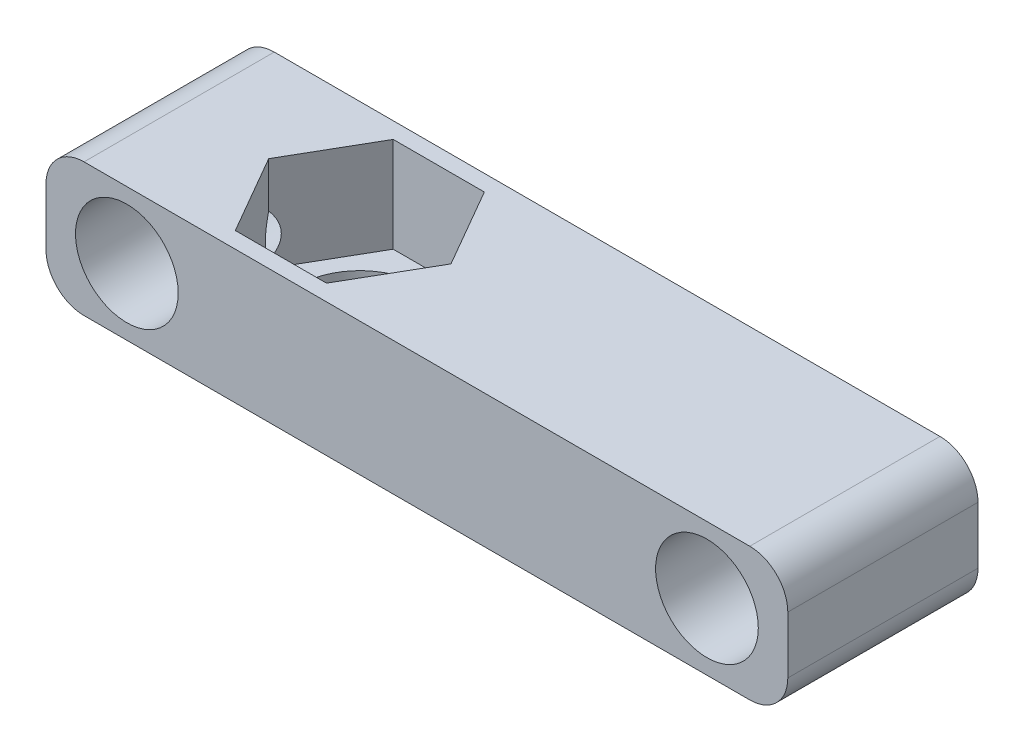
ISO-10303-21;
HEADER;
FILE_DESCRIPTION(('STEP AP214'),'2;1');
FILE_NAME('part.step','',(''),(''),'','','');
FILE_SCHEMA(('AUTOMOTIVE_DESIGN { 1 0 10303 214 1 1 1 1 }'));
ENDSEC;
DATA;
#1=APPLICATION_CONTEXT('core data for automotive mechanical design processes');
#2=APPLICATION_PROTOCOL_DEFINITION('international standard','automotive_design',2000,#1);
#3=PRODUCT_CONTEXT('',#1,'mechanical');
#4=PRODUCT('Part','Part','',(#3));
#5=PRODUCT_RELATED_PRODUCT_CATEGORY('part','',(#4));
#6=PRODUCT_DEFINITION_FORMATION('','',#4);
#7=PRODUCT_DEFINITION_CONTEXT('part definition',#1,'design');
#8=PRODUCT_DEFINITION('design','',#6,#7);
#9=PRODUCT_DEFINITION_SHAPE('','',#8);
#10=(LENGTH_UNIT() NAMED_UNIT(*) SI_UNIT(.MILLI.,.METRE.));
#11=(NAMED_UNIT(*) PLANE_ANGLE_UNIT() SI_UNIT($,.RADIAN.));
#12=(NAMED_UNIT(*) SI_UNIT($,.STERADIAN.) SOLID_ANGLE_UNIT());
#13=UNCERTAINTY_MEASURE_WITH_UNIT(LENGTH_MEASURE(1.E-05),#10,'distance_accuracy_value','');
#14=(GEOMETRIC_REPRESENTATION_CONTEXT(3) GLOBAL_UNCERTAINTY_ASSIGNED_CONTEXT((#13)) GLOBAL_UNIT_ASSIGNED_CONTEXT((#10,
#11,#12)) REPRESENTATION_CONTEXT('',''));
#15=CARTESIAN_POINT('',(0.,0.,0.));
#16=DIRECTION('',(0.,0.,1.));
#17=DIRECTION('',(1.,0.,0.));
#18=AXIS2_PLACEMENT_3D('',#15,#16,#17);
#19=CARTESIAN_POINT('',(-32.1206908736811,15.8780487804878,0.849999999999996));
#20=DIRECTION('',(0.866025403784439,0.,-0.5));
#21=DIRECTION('',(-0.5,0.,-0.866025403784439));
#22=AXIS2_PLACEMENT_3D('',#19,#20,#21);
#23=PLANE('',#22);
#24=DIRECTION('',(0.5,0.,0.866025403784439));
#25=VECTOR('',#24,1.);
#26=CARTESIAN_POINT('',(-32.120690873681,10.8780487804878,0.85));
#27=LINE('',#26,#25);
#28=CARTESIAN_POINT('',(-32.1206908736811,10.8780487804878,0.849999999999996));
#29=VERTEX_POINT('',#28);
#30=CARTESIAN_POINT('',(-29.7246872565441,10.8780487804878,5.));
#31=VERTEX_POINT('',#30);
#32=EDGE_CURVE('E155',#29,#31,#27,.T.);
#33=ORIENTED_EDGE('',*,*,#32,.T.);
#34=DIRECTION('',(0.,-1.,0.));
#35=VECTOR('',#34,1.);
#36=CARTESIAN_POINT('',(-29.7246872565441,15.8780487804878,5.00000000000001));
#37=LINE('',#36,#35);
#38=CARTESIAN_POINT('',(-29.7246872565441,15.8780487804878,5.00000000000001));
#39=VERTEX_POINT('',#38);
#40=EDGE_CURVE('E139',#39,#31,#37,.T.);
#41=ORIENTED_EDGE('',*,*,#40,.F.);
#42=DIRECTION('',(0.5,0.,0.866025403784439));
#43=VECTOR('',#42,1.);
#44=CARTESIAN_POINT('',(-32.1206908736811,15.8780487804878,0.849999999999996));
#45=LINE('',#44,#43);
#46=CARTESIAN_POINT('',(-32.1206908736811,15.8780487804878,0.849999999999996));
#47=VERTEX_POINT('',#46);
#48=EDGE_CURVE('E172',#47,#39,#45,.T.);
#49=ORIENTED_EDGE('',*,*,#48,.F.);
#50=DIRECTION('',(0.,-1.,0.));
#51=VECTOR('',#50,1.);
#52=CARTESIAN_POINT('',(-32.1206908736811,15.8780487804878,0.849999999999996));
#53=LINE('',#52,#51);
#54=EDGE_CURVE('E156',#47,#29,#53,.T.);
#55=ORIENTED_EDGE('',*,*,#54,.T.);
#56=EDGE_LOOP('',(#33,#41,#49,#55));
#57=FACE_BOUND('',#56,.T.);
#58=ADVANCED_FACE('F33',(#57),#23,.F.);
#59=CARTESIAN_POINT('',(-36.912698107955,15.8780487804878,0.849999999999997));
#60=DIRECTION('',(0.,0.,-1.));
#61=DIRECTION('',(-1.,0.,0.));
#62=AXIS2_PLACEMENT_3D('',#59,#60,#61);
#63=PLANE('',#62);
#64=DIRECTION('',(1.,0.,0.));
#65=VECTOR('',#64,1.);
#66=CARTESIAN_POINT('',(-36.9126981079549,10.8780487804878,0.850000000000001));
#67=LINE('',#66,#65);
#68=CARTESIAN_POINT('',(-36.912698107955,10.8780487804878,0.849999999999997));
#69=VERTEX_POINT('',#68);
#70=EDGE_CURVE('E48',#69,#29,#67,.T.);
#71=ORIENTED_EDGE('',*,*,#70,.T.);
#72=ORIENTED_EDGE('',*,*,#54,.F.);
#73=DIRECTION('',(1.,0.,0.));
#74=VECTOR('',#73,1.);
#75=CARTESIAN_POINT('',(-36.912698107955,15.8780487804878,0.849999999999997));
#76=LINE('',#75,#74);
#77=CARTESIAN_POINT('',(-36.912698107955,15.8780487804878,0.849999999999997));
#78=VERTEX_POINT('',#77);
#79=EDGE_CURVE('E152',#78,#47,#76,.T.);
#80=ORIENTED_EDGE('',*,*,#79,.F.);
#81=DIRECTION('',(0.,-1.,0.));
#82=VECTOR('',#81,1.);
#83=CARTESIAN_POINT('',(-36.912698107955,15.8780487804878,0.849999999999997));
#84=LINE('',#83,#82);
#85=EDGE_CURVE('E188',#78,#69,#84,.T.);
#86=ORIENTED_EDGE('',*,*,#85,.T.);
#87=EDGE_LOOP('',(#71,#72,#80,#86));
#88=FACE_BOUND('',#87,.T.);
#89=ADVANCED_FACE('F320',(#88),#63,.F.);
#90=CARTESIAN_POINT('',(-39.3087017250919,15.8780487804878,4.99999999999999));
#91=DIRECTION('',(-0.866025403784438,0.,-0.5));
#92=DIRECTION('',(-0.5,0.,0.866025403784439));
#93=AXIS2_PLACEMENT_3D('',#90,#91,#92);
#94=PLANE('',#93);
#95=DIRECTION('',(0.5,0.,-0.866025403784438));
#96=VECTOR('',#95,1.);
#97=CARTESIAN_POINT('',(-39.3087017250919,10.8780487804878,4.99999999999999));
#98=LINE('',#97,#96);
#99=CARTESIAN_POINT('',(-39.3087017250919,10.8780487804878,4.99999999999999));
#100=VERTEX_POINT('',#99);
#101=EDGE_CURVE('E56',#100,#69,#98,.T.);
#102=ORIENTED_EDGE('',*,*,#101,.T.);
#103=ORIENTED_EDGE('',*,*,#85,.F.);
#104=DIRECTION('',(0.5,0.,-0.866025403784438));
#105=VECTOR('',#104,1.);
#106=CARTESIAN_POINT('',(-39.3087017250919,15.8780487804878,4.99999999999999));
#107=LINE('',#106,#105);
#108=CARTESIAN_POINT('',(-39.3087017250919,15.8780487804878,4.99999999999999));
#109=VERTEX_POINT('',#108);
#110=EDGE_CURVE('E181',#109,#78,#107,.T.);
#111=ORIENTED_EDGE('',*,*,#110,.F.);
#112=DIRECTION('',(0.,-1.,0.));
#113=VECTOR('',#112,1.);
#114=CARTESIAN_POINT('',(-39.3087017250919,15.8780487804878,4.99999999999999));
#115=LINE('',#114,#113);
#116=CARTESIAN_POINT('',(-39.3087017250919,13.4953095216034,4.99999999999999));
#117=VERTEX_POINT('',#116);
#118=EDGE_CURVE('E190',#109,#117,#115,.T.);
#119=ORIENTED_EDGE('',*,*,#118,.T.);
#120=CARTESIAN_POINT('',(-41.766694490818,12.3780487804878,9.25736835487436));
#121=DIRECTION('',(-0.866025403784438,0.,-0.5));
#122=DIRECTION('',(0.5,0.,-0.866025403784439));
#123=AXIS2_PLACEMENT_3D('',#120,#121,#122);
#124=ELLIPSE('',#123,5.39999999999999,2.7);
#125=CARTESIAN_POINT('',(-39.3087017250919,11.2607880393722,4.99999999999999));
#126=VERTEX_POINT('',#125);
#127=EDGE_CURVE('E235',#117,#126,#124,.T.);
#128=ORIENTED_EDGE('',*,*,#127,.T.);
#129=EDGE_CURVE('E193',#126,#100,#115,.T.);
#130=ORIENTED_EDGE('',*,*,#129,.T.);
#131=EDGE_LOOP('',(#102,#103,#111,#119,#128,#130));
#132=FACE_BOUND('',#131,.T.);
#133=ADVANCED_FACE('F325',(#132),#94,.F.);
#134=CARTESIAN_POINT('',(-36.912698107955,15.8780487804878,9.15));
#135=DIRECTION('',(-0.866025403784439,0.,0.5));
#136=DIRECTION('',(0.5,0.,0.866025403784439));
#137=AXIS2_PLACEMENT_3D('',#134,#135,#136);
#138=PLANE('',#137);
#139=DIRECTION('',(-0.5,0.,-0.866025403784439));
#140=VECTOR('',#139,1.);
#141=CARTESIAN_POINT('',(-36.9126981079549,10.8780487804878,9.15));
#142=LINE('',#141,#140);
#143=CARTESIAN_POINT('',(-36.912698107955,10.8780487804878,9.15));
#144=VERTEX_POINT('',#143);
#145=EDGE_CURVE('E165',#144,#100,#142,.T.);
#146=ORIENTED_EDGE('',*,*,#145,.T.);
#147=ORIENTED_EDGE('',*,*,#129,.F.);
#148=CARTESIAN_POINT('',(-41.766694490818,12.3780487804878,0.742631645125618));
#149=DIRECTION('',(-0.866025403784439,0.,0.5));
#150=DIRECTION('',(-0.5,0.,-0.866025403784439));
#151=AXIS2_PLACEMENT_3D('',#148,#149,#150);
#152=ELLIPSE('',#151,5.4,2.7);
#153=EDGE_CURVE('E223',#126,#117,#152,.T.);
#154=ORIENTED_EDGE('',*,*,#153,.T.);
#155=ORIENTED_EDGE('',*,*,#118,.F.);
#156=DIRECTION('',(-0.5,0.,-0.866025403784439));
#157=VECTOR('',#156,1.);
#158=CARTESIAN_POINT('',(-36.912698107955,15.8780487804878,9.15));
#159=LINE('',#158,#157);
#160=CARTESIAN_POINT('',(-36.912698107955,15.8780487804878,9.15));
#161=VERTEX_POINT('',#160);
#162=EDGE_CURVE('E178',#161,#109,#159,.T.);
#163=ORIENTED_EDGE('',*,*,#162,.F.);
#164=DIRECTION('',(0.,-1.,0.));
#165=VECTOR('',#164,1.);
#166=CARTESIAN_POINT('',(-36.912698107955,15.8780487804878,9.15));
#167=LINE('',#166,#165);
#168=EDGE_CURVE('E194',#161,#144,#167,.T.);
#169=ORIENTED_EDGE('',*,*,#168,.T.);
#170=EDGE_LOOP('',(#146,#147,#154,#155,#163,#169));
#171=FACE_BOUND('',#170,.T.);
#172=ADVANCED_FACE('F388',(#171),#138,.F.);
#173=CARTESIAN_POINT('',(-32.1206908736811,15.8780487804878,9.15));
#174=DIRECTION('',(0.,0.,1.));
#175=DIRECTION('',(1.,0.,0.));
#176=AXIS2_PLACEMENT_3D('',#173,#174,#175);
#177=PLANE('',#176);
#178=DIRECTION('',(-1.,0.,0.));
#179=VECTOR('',#178,1.);
#180=CARTESIAN_POINT('',(-32.120690873681,10.8780487804878,9.15));
#181=LINE('',#180,#179);
#182=CARTESIAN_POINT('',(-32.1206908736811,10.8780487804878,9.15));
#183=VERTEX_POINT('',#182);
#184=EDGE_CURVE('E163',#183,#144,#181,.T.);
#185=ORIENTED_EDGE('',*,*,#184,.T.);
#186=ORIENTED_EDGE('',*,*,#168,.F.);
#187=DIRECTION('',(-1.,0.,0.));
#188=VECTOR('',#187,1.);
#189=CARTESIAN_POINT('',(-32.1206908736811,15.8780487804878,9.15));
#190=LINE('',#189,#188);
#191=CARTESIAN_POINT('',(-32.1206908736811,15.8780487804878,9.15));
#192=VERTEX_POINT('',#191);
#193=EDGE_CURVE('E175',#192,#161,#190,.T.);
#194=ORIENTED_EDGE('',*,*,#193,.F.);
#195=DIRECTION('',(0.,-1.,0.));
#196=VECTOR('',#195,1.);
#197=CARTESIAN_POINT('',(-32.1206908736811,15.8780487804878,9.15));
#198=LINE('',#197,#196);
#199=EDGE_CURVE('E151',#192,#183,#198,.T.);
#200=ORIENTED_EDGE('',*,*,#199,.T.);
#201=EDGE_LOOP('',(#185,#186,#194,#200));
#202=FACE_BOUND('',#201,.T.);
#203=ADVANCED_FACE('F397',(#202),#177,.F.);
#204=CARTESIAN_POINT('',(-29.7246872565441,15.8780487804878,5.00000000000001));
#205=DIRECTION('',(0.866025403784439,0.,0.5));
#206=DIRECTION('',(0.5,0.,-0.866025403784439));
#207=AXIS2_PLACEMENT_3D('',#204,#205,#206);
#208=PLANE('',#207);
#209=DIRECTION('',(-0.5,0.,0.866025403784439));
#210=VECTOR('',#209,1.);
#211=CARTESIAN_POINT('',(-29.7246872565441,10.8780487804878,5.));
#212=LINE('',#211,#210);
#213=EDGE_CURVE('E144',#31,#183,#212,.T.);
#214=ORIENTED_EDGE('',*,*,#213,.T.);
#215=ORIENTED_EDGE('',*,*,#199,.F.);
#216=DIRECTION('',(-0.5,0.,0.866025403784439));
#217=VECTOR('',#216,1.);
#218=CARTESIAN_POINT('',(-29.7246872565441,15.8780487804878,5.00000000000001));
#219=LINE('',#218,#217);
#220=EDGE_CURVE('E147',#39,#192,#219,.T.);
#221=ORIENTED_EDGE('',*,*,#220,.F.);
#222=ORIENTED_EDGE('',*,*,#40,.T.);
#223=EDGE_LOOP('',(#214,#215,#221,#222));
#224=FACE_BOUND('',#223,.T.);
#225=ADVANCED_FACE('F141',(#224),#208,.F.);
#226=CARTESIAN_POINT('',(0.,0.,10.));
#227=DIRECTION('',(0.,0.,1.));
#228=DIRECTION('',(1.,0.,0.));
#229=AXIS2_PLACEMENT_3D('',#226,#227,#228);
#230=PLANE('',#229);
#231=CARTESIAN_POINT('',(-41.766694490818,12.3780487804878,10.));
#232=DIRECTION('',(0.,0.,1.));
#233=DIRECTION('',(1.,0.,0.));
#234=AXIS2_PLACEMENT_3D('',#231,#232,#233);
#235=CIRCLE('',#234,2.7);
#236=CARTESIAN_POINT('',(-39.066694490818,12.3780487804878,10.));
#237=VERTEX_POINT('',#236);
#238=EDGE_CURVE('E204',#237,#237,#235,.T.);
#239=ORIENTED_EDGE('',*,*,#238,.F.);
#240=EDGE_LOOP('',(#239));
#241=FACE_BOUND('',#240,.T.);
#242=DIRECTION('',(0.,1.,0.));
#243=VECTOR('',#242,1.);
#244=CARTESIAN_POINT('',(-7.01669449081803,15.8780487804878,10.));
#245=LINE('',#244,#243);
#246=CARTESIAN_POINT('',(-7.01669449081803,10.8780487804878,10.));
#247=VERTEX_POINT('',#246);
#248=CARTESIAN_POINT('',(-7.01669449081803,13.8780487804878,10.));
#249=VERTEX_POINT('',#248);
#250=EDGE_CURVE('E217',#247,#249,#245,.T.);
#251=ORIENTED_EDGE('',*,*,#250,.T.);
#252=CARTESIAN_POINT('',(-9.01669449081803,13.8780487804878,10.));
#253=DIRECTION('',(0.,0.,1.));
#254=DIRECTION('',(1.,0.,0.));
#255=AXIS2_PLACEMENT_3D('',#252,#253,#254);
#256=CIRCLE('',#255,2.);
#257=CARTESIAN_POINT('',(-9.01669449081803,15.8780487804878,10.));
#258=VERTEX_POINT('',#257);
#259=EDGE_CURVE('E262',#249,#258,#256,.T.);
#260=ORIENTED_EDGE('',*,*,#259,.T.);
#261=DIRECTION('',(-1.,0.,0.));
#262=VECTOR('',#261,1.);
#263=CARTESIAN_POINT('',(-46.016694490818,15.8780487804878,10.));
#264=LINE('',#263,#262);
#265=CARTESIAN_POINT('',(-44.016694490818,15.8780487804878,10.));
#266=VERTEX_POINT('',#265);
#267=EDGE_CURVE('E220',#258,#266,#264,.T.);
#268=ORIENTED_EDGE('',*,*,#267,.T.);
#269=CARTESIAN_POINT('',(-44.016694490818,13.8780487804878,10.));
#270=DIRECTION('',(0.,0.,1.));
#271=DIRECTION('',(1.,0.,0.));
#272=AXIS2_PLACEMENT_3D('',#269,#270,#271);
#273=CIRCLE('',#272,2.);
#274=CARTESIAN_POINT('',(-46.016694490818,13.8780487804878,10.));
#275=VERTEX_POINT('',#274);
#276=EDGE_CURVE('E256',#266,#275,#273,.T.);
#277=ORIENTED_EDGE('',*,*,#276,.T.);
#278=DIRECTION('',(0.,-1.,0.));
#279=VECTOR('',#278,1.);
#280=CARTESIAN_POINT('',(-46.016694490818,15.8780487804878,10.));
#281=LINE('',#280,#279);
#282=CARTESIAN_POINT('',(-46.016694490818,10.8780487804878,10.));
#283=VERTEX_POINT('',#282);
#284=EDGE_CURVE('E210',#275,#283,#281,.T.);
#285=ORIENTED_EDGE('',*,*,#284,.T.);
#286=CARTESIAN_POINT('',(-44.016694490818,10.8780487804878,10.));
#287=DIRECTION('',(0.,0.,1.));
#288=DIRECTION('',(1.,0.,0.));
#289=AXIS2_PLACEMENT_3D('',#286,#287,#288);
#290=CIRCLE('',#289,2.);
#291=CARTESIAN_POINT('',(-44.016694490818,8.8780487804878,10.));
#292=VERTEX_POINT('',#291);
#293=EDGE_CURVE('E258',#283,#292,#290,.T.);
#294=ORIENTED_EDGE('',*,*,#293,.T.);
#295=DIRECTION('',(1.,0.,0.));
#296=VECTOR('',#295,1.);
#297=CARTESIAN_POINT('',(-46.016694490818,8.8780487804878,10.));
#298=LINE('',#297,#296);
#299=CARTESIAN_POINT('',(-9.01669449081803,8.8780487804878,10.));
#300=VERTEX_POINT('',#299);
#301=EDGE_CURVE('E213',#292,#300,#298,.T.);
#302=ORIENTED_EDGE('',*,*,#301,.T.);
#303=CARTESIAN_POINT('',(-9.01669449081803,10.8780487804878,10.));
#304=DIRECTION('',(0.,0.,1.));
#305=DIRECTION('',(1.,0.,0.));
#306=AXIS2_PLACEMENT_3D('',#303,#304,#305);
#307=CIRCLE('',#306,2.);
#308=EDGE_CURVE('E260',#300,#247,#307,.T.);
#309=ORIENTED_EDGE('',*,*,#308,.T.);
#310=EDGE_LOOP('',(#251,#260,#268,#277,#285,#294,#302,#309));
#311=FACE_BOUND('',#310,.T.);
#312=CARTESIAN_POINT('',(-11.266694490818,12.3780487804878,10.));
#313=DIRECTION('',(0.,0.,1.));
#314=DIRECTION('',(1.,0.,0.));
#315=AXIS2_PLACEMENT_3D('',#312,#313,#314);
#316=CIRCLE('',#315,2.7);
#317=CARTESIAN_POINT('',(-8.56669449081803,12.3780487804878,10.));
#318=VERTEX_POINT('',#317);
#319=EDGE_CURVE('E198',#318,#318,#316,.T.);
#320=ORIENTED_EDGE('',*,*,#319,.F.);
#321=EDGE_LOOP('',(#320));
#322=FACE_BOUND('',#321,.T.);
#323=ADVANCED_FACE('F293',(#241,#311,#322),#230,.T.);
#324=CARTESIAN_POINT('',(0.,0.,0.));
#325=DIRECTION('',(0.,0.,1.));
#326=DIRECTION('',(1.,0.,0.));
#327=AXIS2_PLACEMENT_3D('',#324,#325,#326);
#328=PLANE('',#327);
#329=DIRECTION('',(-1.,0.,0.));
#330=VECTOR('',#329,1.);
#331=CARTESIAN_POINT('',(-46.016694490818,15.8780487804878,0.));
#332=LINE('',#331,#330);
#333=CARTESIAN_POINT('',(-9.01669449081803,15.8780487804878,0.));
#334=VERTEX_POINT('',#333);
#335=CARTESIAN_POINT('',(-44.016694490818,15.8780487804878,0.));
#336=VERTEX_POINT('',#335);
#337=EDGE_CURVE('E214',#334,#336,#332,.T.);
#338=ORIENTED_EDGE('',*,*,#337,.F.);
#339=CARTESIAN_POINT('',(-9.01669449081803,13.8780487804878,0.));
#340=DIRECTION('',(0.,0.,1.));
#341=DIRECTION('',(1.,0.,0.));
#342=AXIS2_PLACEMENT_3D('',#339,#340,#341);
#343=CIRCLE('',#342,2.);
#344=CARTESIAN_POINT('',(-7.01669449081803,13.8780487804878,0.));
#345=VERTEX_POINT('',#344);
#346=EDGE_CURVE('E249',#334,#345,#343,.F.);
#347=ORIENTED_EDGE('',*,*,#346,.T.);
#348=DIRECTION('',(0.,1.,0.));
#349=VECTOR('',#348,1.);
#350=CARTESIAN_POINT('',(-7.01669449081803,15.8780487804878,0.));
#351=LINE('',#350,#349);
#352=CARTESIAN_POINT('',(-7.01669449081803,10.8780487804878,0.));
#353=VERTEX_POINT('',#352);
#354=EDGE_CURVE('E229',#353,#345,#351,.T.);
#355=ORIENTED_EDGE('',*,*,#354,.F.);
#356=CARTESIAN_POINT('',(-9.01669449081803,10.8780487804878,0.));
#357=DIRECTION('',(0.,0.,1.));
#358=DIRECTION('',(1.,0.,0.));
#359=AXIS2_PLACEMENT_3D('',#356,#357,#358);
#360=CIRCLE('',#359,2.);
#361=CARTESIAN_POINT('',(-9.01669449081803,8.8780487804878,0.));
#362=VERTEX_POINT('',#361);
#363=EDGE_CURVE('E247',#353,#362,#360,.F.);
#364=ORIENTED_EDGE('',*,*,#363,.T.);
#365=DIRECTION('',(1.,0.,0.));
#366=VECTOR('',#365,1.);
#367=CARTESIAN_POINT('',(-46.016694490818,8.8780487804878,0.));
#368=LINE('',#367,#366);
#369=CARTESIAN_POINT('',(-44.016694490818,8.8780487804878,0.));
#370=VERTEX_POINT('',#369);
#371=EDGE_CURVE('E226',#370,#362,#368,.T.);
#372=ORIENTED_EDGE('',*,*,#371,.F.);
#373=CARTESIAN_POINT('',(-44.016694490818,10.8780487804878,0.));
#374=DIRECTION('',(0.,0.,1.));
#375=DIRECTION('',(1.,0.,0.));
#376=AXIS2_PLACEMENT_3D('',#373,#374,#375);
#377=CIRCLE('',#376,2.);
#378=CARTESIAN_POINT('',(-46.016694490818,10.8780487804878,0.));
#379=VERTEX_POINT('',#378);
#380=EDGE_CURVE('E245',#370,#379,#377,.F.);
#381=ORIENTED_EDGE('',*,*,#380,.T.);
#382=DIRECTION('',(0.,-1.,0.));
#383=VECTOR('',#382,1.);
#384=CARTESIAN_POINT('',(-46.016694490818,15.8780487804878,0.));
#385=LINE('',#384,#383);
#386=CARTESIAN_POINT('',(-46.016694490818,13.8780487804878,0.));
#387=VERTEX_POINT('',#386);
#388=EDGE_CURVE('E207',#387,#379,#385,.T.);
#389=ORIENTED_EDGE('',*,*,#388,.F.);
#390=CARTESIAN_POINT('',(-44.016694490818,13.8780487804878,0.));
#391=DIRECTION('',(0.,0.,1.));
#392=DIRECTION('',(1.,0.,0.));
#393=AXIS2_PLACEMENT_3D('',#390,#391,#392);
#394=CIRCLE('',#393,2.);
#395=EDGE_CURVE('E243',#387,#336,#394,.F.);
#396=ORIENTED_EDGE('',*,*,#395,.T.);
#397=EDGE_LOOP('',(#338,#347,#355,#364,#372,#381,#389,#396));
#398=FACE_BOUND('',#397,.T.);
#399=CARTESIAN_POINT('',(-41.766694490818,12.3780487804878,0.));
#400=DIRECTION('',(0.,0.,1.));
#401=DIRECTION('',(1.,0.,0.));
#402=AXIS2_PLACEMENT_3D('',#399,#400,#401);
#403=CIRCLE('',#402,2.7);
#404=CARTESIAN_POINT('',(-39.066694490818,12.3780487804878,0.));
#405=VERTEX_POINT('',#404);
#406=EDGE_CURVE('E201',#405,#405,#403,.T.);
#407=ORIENTED_EDGE('',*,*,#406,.T.);
#408=EDGE_LOOP('',(#407));
#409=FACE_BOUND('',#408,.T.);
#410=CARTESIAN_POINT('',(-11.266694490818,12.3780487804878,0.));
#411=DIRECTION('',(0.,0.,1.));
#412=DIRECTION('',(1.,0.,0.));
#413=AXIS2_PLACEMENT_3D('',#410,#411,#412);
#414=CIRCLE('',#413,2.7);
#415=CARTESIAN_POINT('',(-8.56669449081803,12.3780487804878,0.));
#416=VERTEX_POINT('',#415);
#417=EDGE_CURVE('E187',#416,#416,#414,.T.);
#418=ORIENTED_EDGE('',*,*,#417,.T.);
#419=EDGE_LOOP('',(#418));
#420=FACE_BOUND('',#419,.T.);
#421=ADVANCED_FACE('F279',(#398,#409,#420),#328,.F.);
#422=CARTESIAN_POINT('',(-46.016694490818,15.8780487804878,10.));
#423=DIRECTION('',(1.,0.,0.));
#424=DIRECTION('',(0.,0.,-1.));
#425=AXIS2_PLACEMENT_3D('',#422,#423,#424);
#426=PLANE('',#425);
#427=ORIENTED_EDGE('',*,*,#388,.T.);
#428=DIRECTION('',(0.,0.,-1.));
#429=VECTOR('',#428,1.);
#430=CARTESIAN_POINT('',(-46.016694490818,10.8780487804878,10.));
#431=LINE('',#430,#429);
#432=EDGE_CURVE('E11',#379,#283,#431,.F.);
#433=ORIENTED_EDGE('',*,*,#432,.T.);
#434=ORIENTED_EDGE('',*,*,#284,.F.);
#435=DIRECTION('',(0.,0.,-1.));
#436=VECTOR('',#435,1.);
#437=CARTESIAN_POINT('',(-46.016694490818,13.8780487804878,10.));
#438=LINE('',#437,#436);
#439=EDGE_CURVE('E41',#275,#387,#438,.T.);
#440=ORIENTED_EDGE('',*,*,#439,.T.);
#441=EDGE_LOOP('',(#427,#433,#434,#440));
#442=FACE_BOUND('',#441,.T.);
#443=ADVANCED_FACE('F273',(#442),#426,.F.);
#444=CARTESIAN_POINT('',(-46.016694490818,8.8780487804878,10.));
#445=DIRECTION('',(0.,1.,0.));
#446=DIRECTION('',(0.,0.,1.));
#447=AXIS2_PLACEMENT_3D('',#444,#445,#446);
#448=PLANE('',#447);
#449=ORIENTED_EDGE('',*,*,#371,.T.);
#450=DIRECTION('',(0.,0.,-1.));
#451=VECTOR('',#450,1.);
#452=CARTESIAN_POINT('',(-9.01669449081803,8.8780487804878,10.));
#453=LINE('',#452,#451);
#454=EDGE_CURVE('E267',#362,#300,#453,.F.);
#455=ORIENTED_EDGE('',*,*,#454,.T.);
#456=ORIENTED_EDGE('',*,*,#301,.F.);
#457=DIRECTION('',(0.,0.,-1.));
#458=VECTOR('',#457,1.);
#459=CARTESIAN_POINT('',(-44.016694490818,8.8780487804878,10.));
#460=LINE('',#459,#458);
#461=EDGE_CURVE('E264',#292,#370,#460,.T.);
#462=ORIENTED_EDGE('',*,*,#461,.T.);
#463=EDGE_LOOP('',(#449,#455,#456,#462));
#464=FACE_BOUND('',#463,.T.);
#465=CARTESIAN_POINT('',(-34.516694490818,8.8780487804878,5.));
#466=DIRECTION('',(0.,-1.,0.));
#467=DIRECTION('',(0.,0.,-1.));
#468=AXIS2_PLACEMENT_3D('',#465,#466,#467);
#469=CIRCLE('',#468,3.25);
#470=CARTESIAN_POINT('',(-34.516694490818,8.8780487804878,1.75));
#471=VERTEX_POINT('',#470);
#472=EDGE_CURVE('E442',#471,#471,#469,.T.);
#473=ORIENTED_EDGE('',*,*,#472,.F.);
#474=EDGE_LOOP('',(#473));
#475=FACE_BOUND('',#474,.T.);
#476=ADVANCED_FACE('F288',(#464,#475),#448,.F.);
#477=CARTESIAN_POINT('',(-7.01669449081803,15.8780487804878,10.));
#478=DIRECTION('',(-1.,0.,0.));
#479=DIRECTION('',(0.,-1.,0.));
#480=AXIS2_PLACEMENT_3D('',#477,#478,#479);
#481=PLANE('',#480);
#482=ORIENTED_EDGE('',*,*,#354,.T.);
#483=DIRECTION('',(0.,0.,-1.));
#484=VECTOR('',#483,1.);
#485=CARTESIAN_POINT('',(-7.01669449081803,13.8780487804878,10.));
#486=LINE('',#485,#484);
#487=EDGE_CURVE('E254',#345,#249,#486,.F.);
#488=ORIENTED_EDGE('',*,*,#487,.T.);
#489=ORIENTED_EDGE('',*,*,#250,.F.);
#490=DIRECTION('',(0.,0.,-1.));
#491=VECTOR('',#490,1.);
#492=CARTESIAN_POINT('',(-7.01669449081803,10.8780487804878,10.));
#493=LINE('',#492,#491);
#494=EDGE_CURVE('E251',#247,#353,#493,.T.);
#495=ORIENTED_EDGE('',*,*,#494,.T.);
#496=EDGE_LOOP('',(#482,#488,#489,#495));
#497=FACE_BOUND('',#496,.T.);
#498=ADVANCED_FACE('F301',(#497),#481,.F.);
#499=CARTESIAN_POINT('',(-46.016694490818,15.8780487804878,10.));
#500=DIRECTION('',(0.,-1.,0.));
#501=DIRECTION('',(0.,0.,-1.));
#502=AXIS2_PLACEMENT_3D('',#499,#500,#501);
#503=PLANE('',#502);
#504=ORIENTED_EDGE('',*,*,#79,.T.);
#505=ORIENTED_EDGE('',*,*,#48,.T.);
#506=ORIENTED_EDGE('',*,*,#220,.T.);
#507=ORIENTED_EDGE('',*,*,#193,.T.);
#508=ORIENTED_EDGE('',*,*,#162,.T.);
#509=ORIENTED_EDGE('',*,*,#110,.T.);
#510=EDGE_LOOP('',(#504,#505,#506,#507,#508,#509));
#511=FACE_BOUND('',#510,.T.);
#512=ORIENTED_EDGE('',*,*,#267,.F.);
#513=DIRECTION('',(0.,0.,-1.));
#514=VECTOR('',#513,1.);
#515=CARTESIAN_POINT('',(-9.01669449081803,15.8780487804878,10.));
#516=LINE('',#515,#514);
#517=EDGE_CURVE('E240',#258,#334,#516,.T.);
#518=ORIENTED_EDGE('',*,*,#517,.T.);
#519=ORIENTED_EDGE('',*,*,#337,.T.);
#520=DIRECTION('',(0.,0.,-1.));
#521=VECTOR('',#520,1.);
#522=CARTESIAN_POINT('',(-44.016694490818,15.8780487804878,10.));
#523=LINE('',#522,#521);
#524=EDGE_CURVE('E238',#336,#266,#523,.F.);
#525=ORIENTED_EDGE('',*,*,#524,.T.);
#526=EDGE_LOOP('',(#512,#518,#519,#525));
#527=FACE_BOUND('',#526,.T.);
#528=ADVANCED_FACE('F309',(#511,#527),#503,.F.);
#529=CARTESIAN_POINT('',(-41.766694490818,12.3780487804878,10.));
#530=DIRECTION('',(0.,0.,-1.));
#531=DIRECTION('',(-1.,0.,0.));
#532=AXIS2_PLACEMENT_3D('',#529,#530,#531);
#533=CYLINDRICAL_SURFACE('',#532,2.7);
#534=ORIENTED_EDGE('',*,*,#127,.F.);
#535=ORIENTED_EDGE('',*,*,#153,.F.);
#536=EDGE_LOOP('',(#534,#535));
#537=FACE_BOUND('',#536,.T.);
#538=ORIENTED_EDGE('',*,*,#238,.T.);
#539=EDGE_LOOP('',(#538));
#540=FACE_BOUND('',#539,.T.);
#541=ORIENTED_EDGE('',*,*,#406,.F.);
#542=EDGE_LOOP('',(#541));
#543=FACE_BOUND('',#542,.T.);
#544=ADVANCED_FACE('F333',(#537,#540,#543),#533,.F.);
#545=CARTESIAN_POINT('',(-11.266694490818,12.3780487804878,10.));
#546=DIRECTION('',(0.,0.,-1.));
#547=DIRECTION('',(-1.,0.,0.));
#548=AXIS2_PLACEMENT_3D('',#545,#546,#547);
#549=CYLINDRICAL_SURFACE('',#548,2.7);
#550=ORIENTED_EDGE('',*,*,#319,.T.);
#551=EDGE_LOOP('',(#550));
#552=FACE_BOUND('',#551,.T.);
#553=ORIENTED_EDGE('',*,*,#417,.F.);
#554=EDGE_LOOP('',(#553));
#555=FACE_BOUND('',#554,.T.);
#556=ADVANCED_FACE('F330',(#552,#555),#549,.F.);
#557=CARTESIAN_POINT('',(-9.01669449081803,13.8780487804878,10.));
#558=DIRECTION('',(0.,0.,-1.));
#559=DIRECTION('',(-1.,0.,0.));
#560=AXIS2_PLACEMENT_3D('',#557,#558,#559);
#561=CYLINDRICAL_SURFACE('',#560,2.);
#562=ORIENTED_EDGE('',*,*,#259,.F.);
#563=ORIENTED_EDGE('',*,*,#487,.F.);
#564=ORIENTED_EDGE('',*,*,#346,.F.);
#565=ORIENTED_EDGE('',*,*,#517,.F.);
#566=EDGE_LOOP('',(#562,#563,#564,#565));
#567=FACE_BOUND('',#566,.T.);
#568=ADVANCED_FACE('F306',(#567),#561,.T.);
#569=CARTESIAN_POINT('',(-9.01669449081803,10.8780487804878,10.));
#570=DIRECTION('',(0.,0.,-1.));
#571=DIRECTION('',(-1.,0.,0.));
#572=AXIS2_PLACEMENT_3D('',#569,#570,#571);
#573=CYLINDRICAL_SURFACE('',#572,2.);
#574=ORIENTED_EDGE('',*,*,#308,.F.);
#575=ORIENTED_EDGE('',*,*,#454,.F.);
#576=ORIENTED_EDGE('',*,*,#363,.F.);
#577=ORIENTED_EDGE('',*,*,#494,.F.);
#578=EDGE_LOOP('',(#574,#575,#576,#577));
#579=FACE_BOUND('',#578,.T.);
#580=ADVANCED_FACE('F298',(#579),#573,.T.);
#581=CARTESIAN_POINT('',(-44.016694490818,10.8780487804878,10.));
#582=DIRECTION('',(0.,0.,-1.));
#583=DIRECTION('',(-1.,0.,0.));
#584=AXIS2_PLACEMENT_3D('',#581,#582,#583);
#585=CYLINDRICAL_SURFACE('',#584,2.);
#586=ORIENTED_EDGE('',*,*,#293,.F.);
#587=ORIENTED_EDGE('',*,*,#432,.F.);
#588=ORIENTED_EDGE('',*,*,#380,.F.);
#589=ORIENTED_EDGE('',*,*,#461,.F.);
#590=EDGE_LOOP('',(#586,#587,#588,#589));
#591=FACE_BOUND('',#590,.T.);
#592=ADVANCED_FACE('F285',(#591),#585,.T.);
#593=CARTESIAN_POINT('',(-44.016694490818,13.8780487804878,10.));
#594=DIRECTION('',(0.,0.,-1.));
#595=DIRECTION('',(-1.,0.,0.));
#596=AXIS2_PLACEMENT_3D('',#593,#594,#595);
#597=CYLINDRICAL_SURFACE('',#596,2.);
#598=ORIENTED_EDGE('',*,*,#276,.F.);
#599=ORIENTED_EDGE('',*,*,#524,.F.);
#600=ORIENTED_EDGE('',*,*,#395,.F.);
#601=ORIENTED_EDGE('',*,*,#439,.F.);
#602=EDGE_LOOP('',(#598,#599,#600,#601));
#603=FACE_BOUND('',#602,.T.);
#604=ADVANCED_FACE('F35',(#603),#597,.T.);
#605=CARTESIAN_POINT('',(0.,10.8780487804878,0.));
#606=DIRECTION('',(0.,-1.,0.));
#607=DIRECTION('',(0.,0.,-1.));
#608=AXIS2_PLACEMENT_3D('',#605,#606,#607);
#609=PLANE('',#608);
#610=CARTESIAN_POINT('',(-34.516694490818,10.8780487804878,5.));
#611=DIRECTION('',(0.,-1.,0.));
#612=DIRECTION('',(0.,0.,-1.));
#613=AXIS2_PLACEMENT_3D('',#610,#611,#612);
#614=CIRCLE('',#613,3.25);
#615=CARTESIAN_POINT('',(-34.516694490818,10.8780487804878,1.75));
#616=VERTEX_POINT('',#615);
#617=EDGE_CURVE('E158',#616,#616,#614,.T.);
#618=ORIENTED_EDGE('',*,*,#617,.T.);
#619=EDGE_LOOP('',(#618));
#620=FACE_BOUND('',#619,.T.);
#621=ORIENTED_EDGE('',*,*,#32,.F.);
#622=ORIENTED_EDGE('',*,*,#70,.F.);
#623=ORIENTED_EDGE('',*,*,#101,.F.);
#624=ORIENTED_EDGE('',*,*,#145,.F.);
#625=ORIENTED_EDGE('',*,*,#184,.F.);
#626=ORIENTED_EDGE('',*,*,#213,.F.);
#627=EDGE_LOOP('',(#621,#622,#623,#624,#625,#626));
#628=FACE_BOUND('',#627,.T.);
#629=ADVANCED_FACE('F161',(#620,#628),#609,.F.);
#630=CARTESIAN_POINT('',(-34.516694490818,10.8780487804878,5.));
#631=DIRECTION('',(0.,-1.,0.));
#632=DIRECTION('',(0.,0.,-1.));
#633=AXIS2_PLACEMENT_3D('',#630,#631,#632);
#634=CYLINDRICAL_SURFACE('',#633,3.25);
#635=ORIENTED_EDGE('',*,*,#617,.F.);
#636=EDGE_LOOP('',(#635));
#637=FACE_BOUND('',#636,.T.);
#638=ORIENTED_EDGE('',*,*,#472,.T.);
#639=EDGE_LOOP('',(#638));
#640=FACE_BOUND('',#639,.T.);
#641=ADVANCED_FACE('F316',(#637,#640),#634,.F.);
#642=CLOSED_SHELL('',(#58,#89,#133,#172,#203,#225,#323,#421,#443,#476,#498,#528,#544,#556,#568,
#580,#592,#604,#629,#641));
#643=MANIFOLD_SOLID_BREP('B2',#642);
#644=ADVANCED_BREP_SHAPE_REPRESENTATION('',(#18,#643),#14);
#645=SHAPE_DEFINITION_REPRESENTATION(#9,#644);
ENDSEC;
END-ISO-10303-21;
